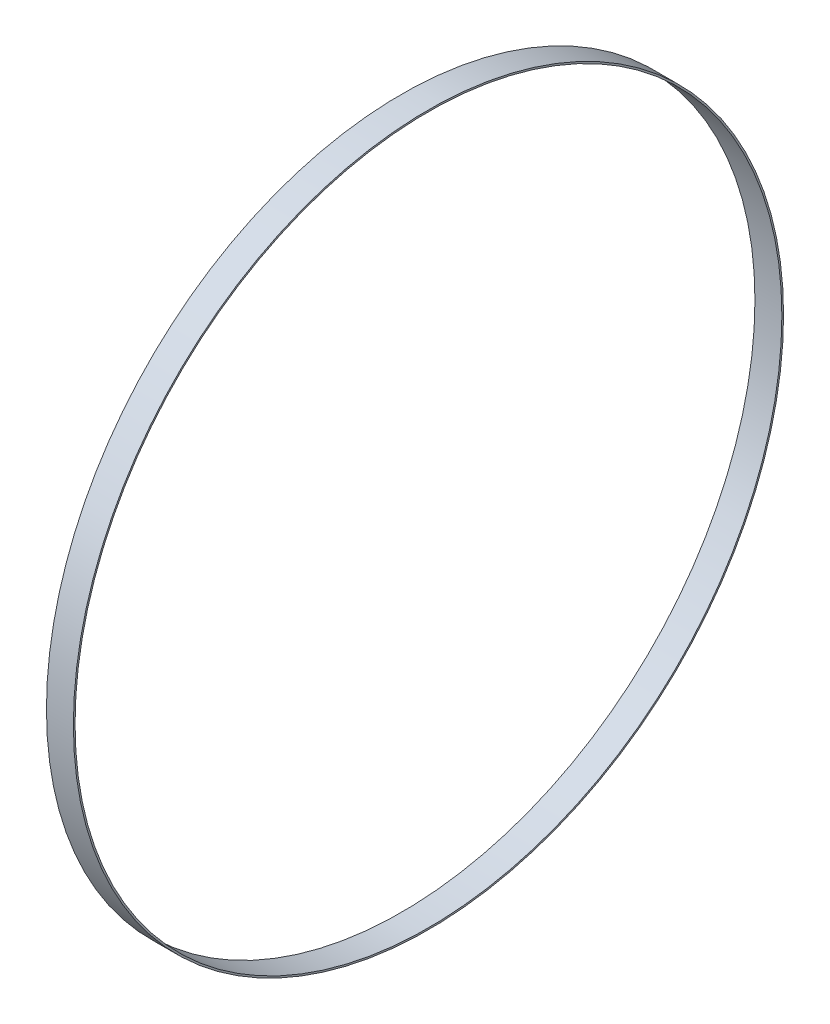
ISO-10303-21;
HEADER;
FILE_DESCRIPTION(('STEP AP214'),'2;1');
FILE_NAME('part.step','',(''),(''),'','','');
FILE_SCHEMA(('AUTOMOTIVE_DESIGN { 1 0 10303 214 1 1 1 1 }'));
ENDSEC;
DATA;
#1=APPLICATION_CONTEXT('core data for automotive mechanical design processes');
#2=APPLICATION_PROTOCOL_DEFINITION('international standard','automotive_design',2000,#1);
#3=PRODUCT_CONTEXT('',#1,'mechanical');
#4=PRODUCT('Part','Part','',(#3));
#5=PRODUCT_RELATED_PRODUCT_CATEGORY('part','',(#4));
#6=PRODUCT_DEFINITION_FORMATION('','',#4);
#7=PRODUCT_DEFINITION_CONTEXT('part definition',#1,'design');
#8=PRODUCT_DEFINITION('design','',#6,#7);
#9=PRODUCT_DEFINITION_SHAPE('','',#8);
#10=(LENGTH_UNIT() NAMED_UNIT(*) SI_UNIT(.MILLI.,.METRE.));
#11=(NAMED_UNIT(*) PLANE_ANGLE_UNIT() SI_UNIT($,.RADIAN.));
#12=(NAMED_UNIT(*) SI_UNIT($,.STERADIAN.) SOLID_ANGLE_UNIT());
#13=UNCERTAINTY_MEASURE_WITH_UNIT(LENGTH_MEASURE(1.E-05),#10,'distance_accuracy_value','');
#14=(GEOMETRIC_REPRESENTATION_CONTEXT(3) GLOBAL_UNCERTAINTY_ASSIGNED_CONTEXT((#13)) GLOBAL_UNIT_ASSIGNED_CONTEXT((#10,
#11,#12)) REPRESENTATION_CONTEXT('',''));
#15=CARTESIAN_POINT('',(0.,0.,0.));
#16=DIRECTION('',(0.,0.,1.));
#17=DIRECTION('',(1.,0.,0.));
#18=AXIS2_PLACEMENT_3D('',#15,#16,#17);
#19=CARTESIAN_POINT('',(80.,0.,0.));
#20=DIRECTION('',(1.,0.,0.));
#21=DIRECTION('',(0.,0.,-1.));
#22=AXIS2_PLACEMENT_3D('',#19,#20,#21);
#23=PLANE('',#22);
#24=CARTESIAN_POINT('',(80.,0.,0.));
#25=DIRECTION('',(1.,0.,0.));
#26=DIRECTION('',(0.,0.,-1.));
#27=AXIS2_PLACEMENT_3D('',#24,#25,#26);
#28=CIRCLE('',#27,1055.);
#29=CARTESIAN_POINT('',(80.,0.,-1055.));
#30=VERTEX_POINT('',#29);
#31=EDGE_CURVE('E12',#30,#30,#28,.T.);
#32=ORIENTED_EDGE('',*,*,#31,.T.);
#33=EDGE_LOOP('',(#32));
#34=FACE_BOUND('',#33,.T.);
#35=CARTESIAN_POINT('',(80.,0.,0.));
#36=DIRECTION('',(1.,0.,0.));
#37=DIRECTION('',(0.,0.,-1.));
#38=AXIS2_PLACEMENT_3D('',#35,#36,#37);
#39=CIRCLE('',#38,1050.);
#40=CARTESIAN_POINT('',(80.,0.,-1050.));
#41=VERTEX_POINT('',#40);
#42=EDGE_CURVE('E53',#41,#41,#39,.T.);
#43=ORIENTED_EDGE('',*,*,#42,.F.);
#44=EDGE_LOOP('',(#43));
#45=FACE_BOUND('',#44,.T.);
#46=ADVANCED_FACE('F42',(#34,#45),#23,.T.);
#47=CARTESIAN_POINT('',(0.,0.,0.));
#48=DIRECTION('',(1.,0.,0.));
#49=DIRECTION('',(0.,0.,-1.));
#50=AXIS2_PLACEMENT_3D('',#47,#48,#49);
#51=PLANE('',#50);
#52=CARTESIAN_POINT('',(0.,0.,0.));
#53=DIRECTION('',(1.,0.,0.));
#54=DIRECTION('',(0.,0.,-1.));
#55=AXIS2_PLACEMENT_3D('',#52,#53,#54);
#56=CIRCLE('',#55,1055.);
#57=CARTESIAN_POINT('',(0.,0.,-1055.));
#58=VERTEX_POINT('',#57);
#59=EDGE_CURVE('E46',#58,#58,#56,.T.);
#60=ORIENTED_EDGE('',*,*,#59,.F.);
#61=EDGE_LOOP('',(#60));
#62=FACE_BOUND('',#61,.T.);
#63=CARTESIAN_POINT('',(0.,0.,0.));
#64=DIRECTION('',(1.,0.,0.));
#65=DIRECTION('',(0.,0.,-1.));
#66=AXIS2_PLACEMENT_3D('',#63,#64,#65);
#67=CIRCLE('',#66,1050.);
#68=CARTESIAN_POINT('',(0.,0.,-1050.));
#69=VERTEX_POINT('',#68);
#70=EDGE_CURVE('E55',#69,#69,#67,.T.);
#71=ORIENTED_EDGE('',*,*,#70,.T.);
#72=EDGE_LOOP('',(#71));
#73=FACE_BOUND('',#72,.T.);
#74=ADVANCED_FACE('F65',(#62,#73),#51,.F.);
#75=CARTESIAN_POINT('',(80.,0.,0.));
#76=DIRECTION('',(-1.,0.,0.));
#77=DIRECTION('',(0.,0.,1.));
#78=AXIS2_PLACEMENT_3D('',#75,#76,#77);
#79=CYLINDRICAL_SURFACE('',#78,1055.);
#80=ORIENTED_EDGE('',*,*,#31,.F.);
#81=EDGE_LOOP('',(#80));
#82=FACE_BOUND('',#81,.T.);
#83=ORIENTED_EDGE('',*,*,#59,.T.);
#84=EDGE_LOOP('',(#83));
#85=FACE_BOUND('',#84,.T.);
#86=ADVANCED_FACE('F44',(#82,#85),#79,.T.);
#87=CARTESIAN_POINT('',(80.,0.,0.));
#88=DIRECTION('',(-1.,0.,0.));
#89=DIRECTION('',(0.,0.,1.));
#90=AXIS2_PLACEMENT_3D('',#87,#88,#89);
#91=CYLINDRICAL_SURFACE('',#90,1050.);
#92=ORIENTED_EDGE('',*,*,#42,.T.);
#93=EDGE_LOOP('',(#92));
#94=FACE_BOUND('',#93,.T.);
#95=ORIENTED_EDGE('',*,*,#70,.F.);
#96=EDGE_LOOP('',(#95));
#97=FACE_BOUND('',#96,.T.);
#98=ADVANCED_FACE('F61',(#94,#97),#91,.F.);
#99=CLOSED_SHELL('',(#46,#74,#86,#98));
#100=MANIFOLD_SOLID_BREP('B2',#99);
#101=ADVANCED_BREP_SHAPE_REPRESENTATION('',(#18,#100),#14);
#102=SHAPE_DEFINITION_REPRESENTATION(#9,#101);
ENDSEC;
END-ISO-10303-21;
